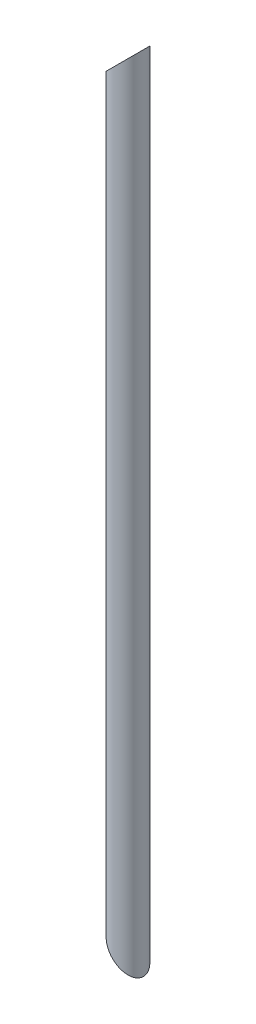
ISO-10303-21;
HEADER;
FILE_DESCRIPTION(('STEP AP214'),'2;1');
FILE_NAME('part.step','',(''),(''),'','','');
FILE_SCHEMA(('AUTOMOTIVE_DESIGN { 1 0 10303 214 1 1 1 1 }'));
ENDSEC;
DATA;
#1=APPLICATION_CONTEXT('core data for automotive mechanical design processes');
#2=APPLICATION_PROTOCOL_DEFINITION('international standard','automotive_design',2000,#1);
#3=PRODUCT_CONTEXT('',#1,'mechanical');
#4=PRODUCT('Part','Part','',(#3));
#5=PRODUCT_RELATED_PRODUCT_CATEGORY('part','',(#4));
#6=PRODUCT_DEFINITION_FORMATION('','',#4);
#7=PRODUCT_DEFINITION_CONTEXT('part definition',#1,'design');
#8=PRODUCT_DEFINITION('design','',#6,#7);
#9=PRODUCT_DEFINITION_SHAPE('','',#8);
#10=(LENGTH_UNIT() NAMED_UNIT(*) SI_UNIT(.MILLI.,.METRE.));
#11=(NAMED_UNIT(*) PLANE_ANGLE_UNIT() SI_UNIT($,.RADIAN.));
#12=(NAMED_UNIT(*) SI_UNIT($,.STERADIAN.) SOLID_ANGLE_UNIT());
#13=UNCERTAINTY_MEASURE_WITH_UNIT(LENGTH_MEASURE(1.E-05),#10,'distance_accuracy_value','');
#14=(GEOMETRIC_REPRESENTATION_CONTEXT(3) GLOBAL_UNCERTAINTY_ASSIGNED_CONTEXT((#13)) GLOBAL_UNIT_ASSIGNED_CONTEXT((#10,
#11,#12)) REPRESENTATION_CONTEXT('',''));
#15=CARTESIAN_POINT('',(0.,0.,0.));
#16=DIRECTION('',(0.,0.,1.));
#17=DIRECTION('',(1.,0.,0.));
#18=AXIS2_PLACEMENT_3D('',#15,#16,#17);
#19=CARTESIAN_POINT('',(0.,0.,0.));
#20=DIRECTION('',(0.,-1.,0.));
#21=DIRECTION('',(1.,0.,0.));
#22=AXIS2_PLACEMENT_3D('',#19,#20,#21);
#23=CYLINDRICAL_SURFACE('',#22,31.7500000000001);
#24=CARTESIAN_POINT('',(-4.9679221174536E-13,1618.25,0.));
#25=DIRECTION('',(0.707106781186547,-0.707106781186548,0.));
#26=DIRECTION('',(-0.707106781186548,-0.707106781186547,0.));
#27=AXIS2_PLACEMENT_3D('',#24,#25,#26);
#28=ELLIPSE('',#27,44.9012806053459,31.7500000000001);
#29=CARTESIAN_POINT('',(-31.7500000000006,1586.5,0.));
#30=VERTEX_POINT('',#29);
#31=EDGE_CURVE('E39',#30,#30,#28,.F.);
#32=ORIENTED_EDGE('',*,*,#31,.F.);
#33=EDGE_LOOP('',(#32));
#34=FACE_BOUND('',#33,.T.);
#35=CARTESIAN_POINT('',(0.,31.7499999999999,0.));
#36=DIRECTION('',(0.707106781186545,0.70710678118655,0.));
#37=DIRECTION('',(0.70710678118655,-0.707106781186545,0.));
#38=AXIS2_PLACEMENT_3D('',#35,#36,#37);
#39=ELLIPSE('',#38,44.9012806053457,31.7500000000001);
#40=CARTESIAN_POINT('',(31.7500000000001,0.,0.));
#41=VERTEX_POINT('',#40);
#42=EDGE_CURVE('E10',#41,#41,#39,.F.);
#43=ORIENTED_EDGE('',*,*,#42,.F.);
#44=EDGE_LOOP('',(#43));
#45=FACE_BOUND('',#44,.T.);
#46=ADVANCED_FACE('F32',(#34,#45),#23,.T.);
#47=CARTESIAN_POINT('',(31.7500000000001,0.,-31.7500000000002));
#48=DIRECTION('',(0.707106781186545,0.70710678118655,0.));
#49=DIRECTION('',(-0.70710678118655,0.707106781186545,0.));
#50=AXIS2_PLACEMENT_3D('',#47,#48,#49);
#51=PLANE('',#50);
#52=CARTESIAN_POINT('',(0.,31.7499999999999,0.));
#53=DIRECTION('',(0.707106781186545,0.70710678118655,0.));
#54=DIRECTION('',(0.70710678118655,-0.707106781186545,0.));
#55=AXIS2_PLACEMENT_3D('',#52,#53,#54);
#56=ELLIPSE('',#55,43.4870670429725,30.75);
#57=CARTESIAN_POINT('',(30.75,1.00000000000019,0.));
#58=VERTEX_POINT('',#57);
#59=EDGE_CURVE('E43',#58,#58,#56,.F.);
#60=ORIENTED_EDGE('',*,*,#59,.F.);
#61=EDGE_LOOP('',(#60));
#62=FACE_BOUND('',#61,.T.);
#63=ORIENTED_EDGE('',*,*,#42,.T.);
#64=EDGE_LOOP('',(#63));
#65=FACE_BOUND('',#64,.T.);
#66=ADVANCED_FACE('F57',(#62,#65),#51,.F.);
#67=CARTESIAN_POINT('',(31.7499999999996,1650.,-31.7500000000002));
#68=DIRECTION('',(0.707106781186547,-0.707106781186548,0.));
#69=DIRECTION('',(0.707106781186548,0.707106781186547,0.));
#70=AXIS2_PLACEMENT_3D('',#67,#68,#69);
#71=PLANE('',#70);
#72=CARTESIAN_POINT('',(0.,1618.25,0.));
#73=DIRECTION('',(0.707106781186547,-0.707106781186548,0.));
#74=DIRECTION('',(-0.707106781186548,-0.707106781186547,0.));
#75=AXIS2_PLACEMENT_3D('',#72,#73,#74);
#76=ELLIPSE('',#75,43.4870670429726,30.75);
#77=CARTESIAN_POINT('',(-30.75,1587.5,0.));
#78=VERTEX_POINT('',#77);
#79=EDGE_CURVE('E35',#78,#78,#76,.F.);
#80=ORIENTED_EDGE('',*,*,#79,.F.);
#81=EDGE_LOOP('',(#80));
#82=FACE_BOUND('',#81,.T.);
#83=ORIENTED_EDGE('',*,*,#31,.T.);
#84=EDGE_LOOP('',(#83));
#85=FACE_BOUND('',#84,.T.);
#86=ADVANCED_FACE('F54',(#82,#85),#71,.F.);
#87=CARTESIAN_POINT('',(0.,1650.,0.));
#88=DIRECTION('',(0.,-1.,0.));
#89=DIRECTION('',(0.,0.,-1.));
#90=AXIS2_PLACEMENT_3D('',#87,#88,#89);
#91=CYLINDRICAL_SURFACE('',#90,30.75);
#92=ORIENTED_EDGE('',*,*,#79,.T.);
#93=EDGE_LOOP('',(#92));
#94=FACE_BOUND('',#93,.T.);
#95=ORIENTED_EDGE('',*,*,#59,.T.);
#96=EDGE_LOOP('',(#95));
#97=FACE_BOUND('',#96,.T.);
#98=ADVANCED_FACE('F52',(#94,#97),#91,.F.);
#99=CLOSED_SHELL('',(#46,#66,#86,#98));
#100=MANIFOLD_SOLID_BREP('B2',#99);
#101=ADVANCED_BREP_SHAPE_REPRESENTATION('',(#18,#100),#14);
#102=SHAPE_DEFINITION_REPRESENTATION(#9,#101);
ENDSEC;
END-ISO-10303-21;
